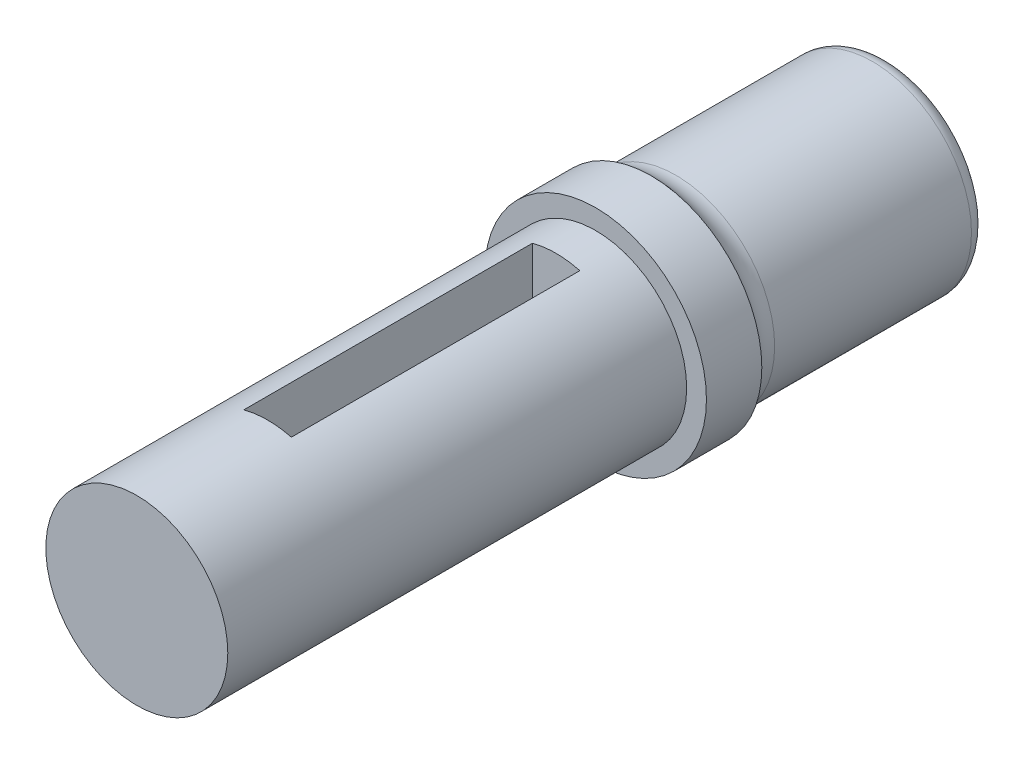
ISO-10303-21;
HEADER;
FILE_DESCRIPTION(('STEP AP214'),'2;1');
FILE_NAME('part.step','',(''),(''),'','','');
FILE_SCHEMA(('AUTOMOTIVE_DESIGN { 1 0 10303 214 1 1 1 1 }'));
ENDSEC;
DATA;
#1=APPLICATION_CONTEXT('core data for automotive mechanical design processes');
#2=APPLICATION_PROTOCOL_DEFINITION('international standard','automotive_design',2000,#1);
#3=PRODUCT_CONTEXT('',#1,'mechanical');
#4=PRODUCT('Part','Part','',(#3));
#5=PRODUCT_RELATED_PRODUCT_CATEGORY('part','',(#4));
#6=PRODUCT_DEFINITION_FORMATION('','',#4);
#7=PRODUCT_DEFINITION_CONTEXT('part definition',#1,'design');
#8=PRODUCT_DEFINITION('design','',#6,#7);
#9=PRODUCT_DEFINITION_SHAPE('','',#8);
#10=(LENGTH_UNIT() NAMED_UNIT(*) SI_UNIT(.MILLI.,.METRE.));
#11=(NAMED_UNIT(*) PLANE_ANGLE_UNIT() SI_UNIT($,.RADIAN.));
#12=(NAMED_UNIT(*) SI_UNIT($,.STERADIAN.) SOLID_ANGLE_UNIT());
#13=UNCERTAINTY_MEASURE_WITH_UNIT(LENGTH_MEASURE(1.E-05),#10,'distance_accuracy_value','');
#14=(GEOMETRIC_REPRESENTATION_CONTEXT(3) GLOBAL_UNCERTAINTY_ASSIGNED_CONTEXT((#13)) GLOBAL_UNIT_ASSIGNED_CONTEXT((#10,
#11,#12)) REPRESENTATION_CONTEXT('',''));
#15=CARTESIAN_POINT('',(0.,0.,0.));
#16=DIRECTION('',(0.,0.,1.));
#17=DIRECTION('',(1.,0.,0.));
#18=AXIS2_PLACEMENT_3D('',#15,#16,#17);
#19=CARTESIAN_POINT('',(0.,0.,325.));
#20=DIRECTION('',(0.,0.,-1.));
#21=DIRECTION('',(-1.,0.,0.));
#22=AXIS2_PLACEMENT_3D('',#19,#20,#21);
#23=CYLINDRICAL_SURFACE('',#22,57.5);
#24=DIRECTION('',(0.,0.,-1.));
#25=VECTOR('',#24,1.);
#26=CARTESIAN_POINT('',(15.,-55.5090082779363,325.));
#27=LINE('',#26,#25);
#28=CARTESIAN_POINT('',(15.,-55.5090082779363,60.));
#29=VERTEX_POINT('',#28);
#30=CARTESIAN_POINT('',(15.,-55.5090082779363,237.687124655086));
#31=VERTEX_POINT('',#30);
#32=EDGE_CURVE('E92',#29,#31,#27,.F.);
#33=ORIENTED_EDGE('',*,*,#32,.F.);
#34=CARTESIAN_POINT('',(0.,0.,60.));
#35=DIRECTION('',(0.,0.,1.));
#36=DIRECTION('',(0.,-1.,0.));
#37=AXIS2_PLACEMENT_3D('',#34,#35,#36);
#38=CIRCLE('',#37,57.5);
#39=CARTESIAN_POINT('',(-15.,-55.5090082779363,60.));
#40=VERTEX_POINT('',#39);
#41=EDGE_CURVE('E84',#40,#29,#38,.T.);
#42=ORIENTED_EDGE('',*,*,#41,.F.);
#43=DIRECTION('',(0.,0.,-1.));
#44=VECTOR('',#43,1.);
#45=CARTESIAN_POINT('',(-15.,-55.5090082779363,325.));
#46=LINE('',#45,#44);
#47=CARTESIAN_POINT('',(-15.,-55.5090082779363,237.687124655086));
#48=VERTEX_POINT('',#47);
#49=EDGE_CURVE('E73',#40,#48,#46,.F.);
#50=ORIENTED_EDGE('',*,*,#49,.T.);
#51=CARTESIAN_POINT('',(0.,0.,240.));
#52=DIRECTION('',(0.,0.0416305447121814,-0.999133073092352));
#53=DIRECTION('',(0.,-0.999133073092352,-0.0416305447121814));
#54=AXIS2_PLACEMENT_3D('',#51,#52,#53);
#55=ELLIPSE('',#54,57.5498915495165,57.5);
#56=EDGE_CURVE('E78',#31,#48,#55,.T.);
#57=ORIENTED_EDGE('',*,*,#56,.F.);
#58=EDGE_LOOP('',(#33,#42,#50,#57));
#59=FACE_BOUND('',#58,.T.);
#60=CARTESIAN_POINT('',(0.,0.,35.));
#61=DIRECTION('',(0.,0.,1.));
#62=DIRECTION('',(1.,0.,0.));
#63=AXIS2_PLACEMENT_3D('',#60,#61,#62);
#64=CIRCLE('',#63,57.5);
#65=CARTESIAN_POINT('',(57.5,0.,35.));
#66=VERTEX_POINT('',#65);
#67=EDGE_CURVE('E106',#66,#66,#64,.F.);
#68=ORIENTED_EDGE('',*,*,#67,.F.);
#69=EDGE_LOOP('',(#68));
#70=FACE_BOUND('',#69,.T.);
#71=CARTESIAN_POINT('',(0.,0.,325.));
#72=DIRECTION('',(0.,0.,1.));
#73=DIRECTION('',(1.,0.,0.));
#74=AXIS2_PLACEMENT_3D('',#71,#72,#73);
#75=CIRCLE('',#74,57.5);
#76=CARTESIAN_POINT('',(57.5,0.,325.));
#77=VERTEX_POINT('',#76);
#78=EDGE_CURVE('E110',#77,#77,#75,.T.);
#79=ORIENTED_EDGE('',*,*,#78,.F.);
#80=EDGE_LOOP('',(#79));
#81=FACE_BOUND('',#80,.T.);
#82=DIRECTION('',(0.,0.,-1.));
#83=VECTOR('',#82,1.);
#84=CARTESIAN_POINT('',(15.,55.5090082779363,325.));
#85=LINE('',#84,#83);
#86=CARTESIAN_POINT('',(15.,55.5090082779363,242.312875344914));
#87=VERTEX_POINT('',#86);
#88=CARTESIAN_POINT('',(15.,55.5090082779363,60.));
#89=VERTEX_POINT('',#88);
#90=EDGE_CURVE('E98',#87,#89,#85,.T.);
#91=ORIENTED_EDGE('',*,*,#90,.F.);
#92=CARTESIAN_POINT('',(-15.,55.5090082779363,242.312875344914));
#93=VERTEX_POINT('',#92);
#94=EDGE_CURVE('E97',#93,#87,#55,.T.);
#95=ORIENTED_EDGE('',*,*,#94,.F.);
#96=DIRECTION('',(0.,0.,-1.));
#97=VECTOR('',#96,1.);
#98=CARTESIAN_POINT('',(-15.,55.5090082779363,325.));
#99=LINE('',#98,#97);
#100=CARTESIAN_POINT('',(-15.,55.5090082779363,59.9999999999999));
#101=VERTEX_POINT('',#100);
#102=EDGE_CURVE('E94',#93,#101,#99,.T.);
#103=ORIENTED_EDGE('',*,*,#102,.T.);
#104=EDGE_CURVE('E87',#89,#101,#38,.T.);
#105=ORIENTED_EDGE('',*,*,#104,.F.);
#106=EDGE_LOOP('',(#91,#95,#103,#105));
#107=FACE_BOUND('',#106,.T.);
#108=ADVANCED_FACE('F35',(#59,#70,#81,#107),#23,.T.);
#109=CARTESIAN_POINT('',(0.,0.,35.));
#110=DIRECTION('',(0.,0.,-1.));
#111=DIRECTION('',(-1.,0.,0.));
#112=AXIS2_PLACEMENT_3D('',#109,#110,#111);
#113=CYLINDRICAL_SURFACE('',#112,70.);
#114=CARTESIAN_POINT('',(0.,0.,35.));
#115=DIRECTION('',(0.,0.,1.));
#116=DIRECTION('',(1.,0.,0.));
#117=AXIS2_PLACEMENT_3D('',#114,#115,#116);
#118=CIRCLE('',#117,70.);
#119=CARTESIAN_POINT('',(70.,0.,35.));
#120=VERTEX_POINT('',#119);
#121=EDGE_CURVE('E113',#120,#120,#118,.T.);
#122=ORIENTED_EDGE('',*,*,#121,.F.);
#123=EDGE_LOOP('',(#122));
#124=FACE_BOUND('',#123,.T.);
#125=CARTESIAN_POINT('',(0.,0.,0.));
#126=DIRECTION('',(0.,0.,1.));
#127=DIRECTION('',(1.,0.,0.));
#128=AXIS2_PLACEMENT_3D('',#125,#126,#127);
#129=CIRCLE('',#128,70.);
#130=CARTESIAN_POINT('',(70.,0.,0.));
#131=VERTEX_POINT('',#130);
#132=EDGE_CURVE('E109',#131,#131,#129,.T.);
#133=ORIENTED_EDGE('',*,*,#132,.T.);
#134=EDGE_LOOP('',(#133));
#135=FACE_BOUND('',#134,.T.);
#136=ADVANCED_FACE('F138',(#124,#135),#113,.T.);
#137=CARTESIAN_POINT('',(0.,0.,35.));
#138=DIRECTION('',(0.,0.,1.));
#139=DIRECTION('',(1.,0.,0.));
#140=AXIS2_PLACEMENT_3D('',#137,#138,#139);
#141=PLANE('',#140);
#142=ORIENTED_EDGE('',*,*,#67,.T.);
#143=EDGE_LOOP('',(#142));
#144=FACE_BOUND('',#143,.T.);
#145=ORIENTED_EDGE('',*,*,#121,.T.);
#146=EDGE_LOOP('',(#145));
#147=FACE_BOUND('',#146,.T.);
#148=ADVANCED_FACE('F143',(#144,#147),#141,.T.);
#149=CARTESIAN_POINT('',(0.,0.,-150.));
#150=DIRECTION('',(0.,0.,1.));
#151=DIRECTION('',(1.,0.,0.));
#152=AXIS2_PLACEMENT_3D('',#149,#150,#151);
#153=CYLINDRICAL_SURFACE('',#152,62.5);
#154=CARTESIAN_POINT('',(0.,0.,-140.));
#155=DIRECTION('',(0.,0.,1.));
#156=DIRECTION('',(1.,0.,0.));
#157=AXIS2_PLACEMENT_3D('',#154,#155,#156);
#158=CIRCLE('',#157,62.5);
#159=CARTESIAN_POINT('',(62.5,0.,-140.));
#160=VERTEX_POINT('',#159);
#161=EDGE_CURVE('E43',#160,#160,#158,.T.);
#162=ORIENTED_EDGE('',*,*,#161,.T.);
#163=EDGE_LOOP('',(#162));
#164=FACE_BOUND('',#163,.T.);
#165=CARTESIAN_POINT('',(0.,0.,-15.612494995996));
#166=DIRECTION('',(0.,0.,1.));
#167=DIRECTION('',(1.,0.,0.));
#168=AXIS2_PLACEMENT_3D('',#165,#166,#167);
#169=CIRCLE('',#168,62.5);
#170=CARTESIAN_POINT('',(62.5,0.,-15.612494995996));
#171=VERTEX_POINT('',#170);
#172=EDGE_CURVE('E79',#171,#171,#169,.F.);
#173=ORIENTED_EDGE('',*,*,#172,.T.);
#174=EDGE_LOOP('',(#173));
#175=FACE_BOUND('',#174,.T.);
#176=ADVANCED_FACE('F154',(#164,#175),#153,.T.);
#177=CARTESIAN_POINT('',(0.,0.,-150.));
#178=DIRECTION('',(0.,0.,1.));
#179=DIRECTION('',(1.,0.,0.));
#180=AXIS2_PLACEMENT_3D('',#177,#178,#179);
#181=PLANE('',#180);
#182=CARTESIAN_POINT('',(0.,0.,-150.));
#183=DIRECTION('',(0.,0.,1.));
#184=DIRECTION('',(1.,0.,0.));
#185=AXIS2_PLACEMENT_3D('',#182,#183,#184);
#186=CIRCLE('',#185,52.5);
#187=CARTESIAN_POINT('',(52.5,0.,-150.));
#188=VERTEX_POINT('',#187);
#189=EDGE_CURVE('E11',#188,#188,#186,.F.);
#190=ORIENTED_EDGE('',*,*,#189,.T.);
#191=EDGE_LOOP('',(#190));
#192=FACE_BOUND('',#191,.T.);
#193=ADVANCED_FACE('F150',(#192),#181,.F.);
#194=CARTESIAN_POINT('',(0.,0.,-15.612494995996));
#195=DIRECTION('',(0.,0.,1.));
#196=DIRECTION('',(1.,0.,0.));
#197=AXIS2_PLACEMENT_3D('',#194,#195,#196);
#198=TOROIDAL_SURFACE('',#197,82.5,20.);
#199=ORIENTED_EDGE('',*,*,#172,.F.);
#200=EDGE_LOOP('',(#199));
#201=FACE_BOUND('',#200,.T.);
#202=ORIENTED_EDGE('',*,*,#132,.F.);
#203=EDGE_LOOP('',(#202));
#204=FACE_BOUND('',#203,.T.);
#205=ADVANCED_FACE('F153',(#201,#204),#198,.F.);
#206=CARTESIAN_POINT('',(0.,0.,325.));
#207=DIRECTION('',(0.,0.,1.));
#208=DIRECTION('',(1.,0.,0.));
#209=AXIS2_PLACEMENT_3D('',#206,#207,#208);
#210=PLANE('',#209);
#211=ORIENTED_EDGE('',*,*,#78,.T.);
#212=EDGE_LOOP('',(#211));
#213=FACE_BOUND('',#212,.T.);
#214=ADVANCED_FACE('F148',(#213),#210,.T.);
#215=CARTESIAN_POINT('',(15.,273.,60.));
#216=DIRECTION('',(0.,0.,1.));
#217=DIRECTION('',(0.,-1.,0.));
#218=AXIS2_PLACEMENT_3D('',#215,#216,#217);
#219=PLANE('',#218);
#220=ORIENTED_EDGE('',*,*,#104,.T.);
#221=DIRECTION('',(0.,1.,0.));
#222=VECTOR('',#221,1.);
#223=CARTESIAN_POINT('',(-15.,-273.,60.));
#224=LINE('',#223,#222);
#225=EDGE_CURVE('E50',#40,#101,#224,.T.);
#226=ORIENTED_EDGE('',*,*,#225,.F.);
#227=ORIENTED_EDGE('',*,*,#41,.T.);
#228=DIRECTION('',(0.,1.,0.));
#229=VECTOR('',#228,1.);
#230=CARTESIAN_POINT('',(15.,-273.,60.));
#231=LINE('',#230,#229);
#232=EDGE_CURVE('E122',#29,#89,#231,.T.);
#233=ORIENTED_EDGE('',*,*,#232,.T.);
#234=EDGE_LOOP('',(#220,#226,#227,#233));
#235=FACE_BOUND('',#234,.T.);
#236=ADVANCED_FACE('F82',(#235),#219,.T.);
#237=CARTESIAN_POINT('',(15.,-273.,228.625));
#238=DIRECTION('',(0.,0.0416305447121814,-0.999133073092352));
#239=DIRECTION('',(0.,0.999133073092352,0.0416305447121814));
#240=AXIS2_PLACEMENT_3D('',#237,#238,#239);
#241=PLANE('',#240);
#242=ORIENTED_EDGE('',*,*,#94,.T.);
#243=DIRECTION('',(0.,-0.999133073092352,-0.0416305447121814));
#244=VECTOR('',#243,1.);
#245=CARTESIAN_POINT('',(15.,0.,240.));
#246=LINE('',#245,#244);
#247=EDGE_CURVE('E120',#87,#31,#246,.T.);
#248=ORIENTED_EDGE('',*,*,#247,.T.);
#249=ORIENTED_EDGE('',*,*,#56,.T.);
#250=DIRECTION('',(0.,-0.999133073092352,-0.0416305447121814));
#251=VECTOR('',#250,1.);
#252=CARTESIAN_POINT('',(-15.,0.,240.));
#253=LINE('',#252,#251);
#254=EDGE_CURVE('E55',#93,#48,#253,.T.);
#255=ORIENTED_EDGE('',*,*,#254,.F.);
#256=EDGE_LOOP('',(#242,#248,#249,#255));
#257=FACE_BOUND('',#256,.T.);
#258=ADVANCED_FACE('F127',(#257),#241,.T.);
#259=CARTESIAN_POINT('',(15.,0.,0.));
#260=DIRECTION('',(-1.,0.,0.));
#261=DIRECTION('',(0.,0.,1.));
#262=AXIS2_PLACEMENT_3D('',#259,#260,#261);
#263=PLANE('',#262);
#264=ORIENTED_EDGE('',*,*,#90,.T.);
#265=ORIENTED_EDGE('',*,*,#232,.F.);
#266=ORIENTED_EDGE('',*,*,#32,.T.);
#267=ORIENTED_EDGE('',*,*,#247,.F.);
#268=EDGE_LOOP('',(#264,#265,#266,#267));
#269=FACE_BOUND('',#268,.T.);
#270=ADVANCED_FACE('F128',(#269),#263,.T.);
#271=CARTESIAN_POINT('',(-15.,0.,0.));
#272=DIRECTION('',(-1.,0.,0.));
#273=DIRECTION('',(0.,0.,1.));
#274=AXIS2_PLACEMENT_3D('',#271,#272,#273);
#275=PLANE('',#274);
#276=ORIENTED_EDGE('',*,*,#254,.T.);
#277=ORIENTED_EDGE('',*,*,#49,.F.);
#278=ORIENTED_EDGE('',*,*,#225,.T.);
#279=ORIENTED_EDGE('',*,*,#102,.F.);
#280=EDGE_LOOP('',(#276,#277,#278,#279));
#281=FACE_BOUND('',#280,.T.);
#282=ADVANCED_FACE('F74',(#281),#275,.F.);
#283=CARTESIAN_POINT('',(0.,0.,-140.));
#284=DIRECTION('',(0.,0.,1.));
#285=DIRECTION('',(1.,0.,0.));
#286=AXIS2_PLACEMENT_3D('',#283,#284,#285);
#287=TOROIDAL_SURFACE('',#286,52.5,10.);
#288=ORIENTED_EDGE('',*,*,#189,.F.);
#289=EDGE_LOOP('',(#288));
#290=FACE_BOUND('',#289,.T.);
#291=ORIENTED_EDGE('',*,*,#161,.F.);
#292=EDGE_LOOP('',(#291));
#293=FACE_BOUND('',#292,.T.);
#294=ADVANCED_FACE('F37',(#290,#293),#287,.T.);
#295=CLOSED_SHELL('',(#108,#136,#148,#176,#193,#205,#214,#236,#258,#270,#282,#294));
#296=MANIFOLD_SOLID_BREP('B2',#295);
#297=ADVANCED_BREP_SHAPE_REPRESENTATION('',(#18,#296),#14);
#298=SHAPE_DEFINITION_REPRESENTATION(#9,#297);
ENDSEC;
END-ISO-10303-21;
